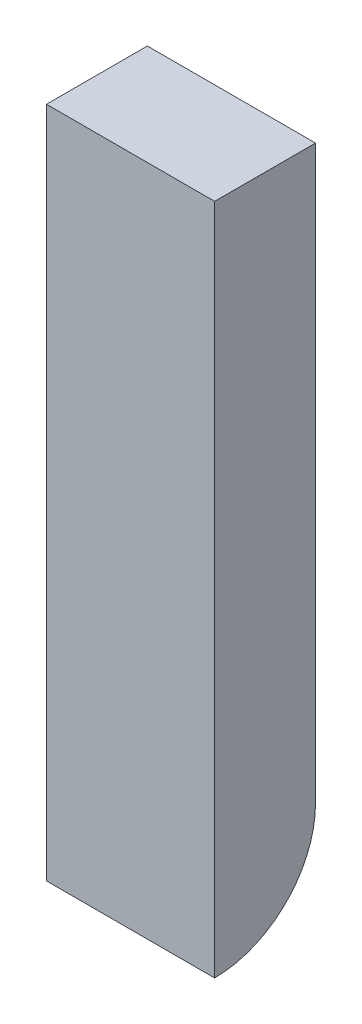
ISO-10303-21;
HEADER;
FILE_DESCRIPTION(('STEP AP214'),'2;1');
FILE_NAME('part.step','',(''),(''),'','','');
FILE_SCHEMA(('AUTOMOTIVE_DESIGN { 1 0 10303 214 1 1 1 1 }'));
ENDSEC;
DATA;
#1=APPLICATION_CONTEXT('core data for automotive mechanical design processes');
#2=APPLICATION_PROTOCOL_DEFINITION('international standard','automotive_design',2000,#1);
#3=PRODUCT_CONTEXT('',#1,'mechanical');
#4=PRODUCT('Part','Part','',(#3));
#5=PRODUCT_RELATED_PRODUCT_CATEGORY('part','',(#4));
#6=PRODUCT_DEFINITION_FORMATION('','',#4);
#7=PRODUCT_DEFINITION_CONTEXT('part definition',#1,'design');
#8=PRODUCT_DEFINITION('design','',#6,#7);
#9=PRODUCT_DEFINITION_SHAPE('','',#8);
#10=(LENGTH_UNIT() NAMED_UNIT(*) SI_UNIT(.MILLI.,.METRE.));
#11=(NAMED_UNIT(*) PLANE_ANGLE_UNIT() SI_UNIT($,.RADIAN.));
#12=(NAMED_UNIT(*) SI_UNIT($,.STERADIAN.) SOLID_ANGLE_UNIT());
#13=UNCERTAINTY_MEASURE_WITH_UNIT(LENGTH_MEASURE(1.E-05),#10,'distance_accuracy_value','');
#14=(GEOMETRIC_REPRESENTATION_CONTEXT(3) GLOBAL_UNCERTAINTY_ASSIGNED_CONTEXT((#13)) GLOBAL_UNIT_ASSIGNED_CONTEXT((#10,
#11,#12)) REPRESENTATION_CONTEXT('',''));
#15=CARTESIAN_POINT('',(0.,0.,0.));
#16=DIRECTION('',(0.,0.,1.));
#17=DIRECTION('',(1.,0.,0.));
#18=AXIS2_PLACEMENT_3D('',#15,#16,#17);
#19=CARTESIAN_POINT('',(-0.65,3.717714614865,0.06250323372777));
#20=DIRECTION('',(1.,0.,0.));
#21=DIRECTION('',(0.,-1.,0.));
#22=AXIS2_PLACEMENT_3D('',#19,#20,#21);
#23=PLANE('',#22);
#24=CARTESIAN_POINT('',(-0.65,3.425,0.12));
#25=DIRECTION('',(1.,0.,0.));
#26=DIRECTION('',(0.,1.,0.));
#27=AXIS2_PLACEMENT_3D('',#24,#25,#26);
#28=CIRCLE('',#27,0.12);
#29=CARTESIAN_POINT('',(-0.65,3.305,0.12));
#30=VERTEX_POINT('',#29);
#31=CARTESIAN_POINT('',(-0.65,3.425,0.));
#32=VERTEX_POINT('',#31);
#33=EDGE_CURVE('E11',#30,#32,#28,.T.);
#34=ORIENTED_EDGE('',*,*,#33,.T.);
#35=DIRECTION('',(0.,1.,0.));
#36=VECTOR('',#35,1.);
#37=CARTESIAN_POINT('',(-0.65,3.425,0.));
#38=LINE('',#37,#36);
#39=CARTESIAN_POINT('',(-0.65,4.105,0.));
#40=VERTEX_POINT('',#39);
#41=EDGE_CURVE('E105',#32,#40,#38,.T.);
#42=ORIENTED_EDGE('',*,*,#41,.T.);
#43=DIRECTION('',(0.,0.,-1.));
#44=VECTOR('',#43,1.);
#45=CARTESIAN_POINT('',(-0.65,4.105,0.12));
#46=LINE('',#45,#44);
#47=CARTESIAN_POINT('',(-0.65,4.105,0.12));
#48=VERTEX_POINT('',#47);
#49=EDGE_CURVE('E65',#48,#40,#46,.T.);
#50=ORIENTED_EDGE('',*,*,#49,.F.);
#51=DIRECTION('',(0.,1.,0.));
#52=VECTOR('',#51,1.);
#53=CARTESIAN_POINT('',(-0.65,3.305,0.12));
#54=LINE('',#53,#52);
#55=EDGE_CURVE('E94',#30,#48,#54,.T.);
#56=ORIENTED_EDGE('',*,*,#55,.F.);
#57=EDGE_LOOP('',(#34,#42,#50,#56));
#58=FACE_BOUND('',#57,.T.);
#59=ADVANCED_FACE('F17',(#58),#23,.T.);
#60=CARTESIAN_POINT('',(-0.85,3.717714614865,0.06250323372777));
#61=DIRECTION('',(1.,0.,0.));
#62=DIRECTION('',(0.,-1.,0.));
#63=AXIS2_PLACEMENT_3D('',#60,#61,#62);
#64=PLANE('',#63);
#65=DIRECTION('',(0.,1.,0.));
#66=VECTOR('',#65,1.);
#67=CARTESIAN_POINT('',(-0.85,3.305,0.12));
#68=LINE('',#67,#66);
#69=CARTESIAN_POINT('',(-0.85,3.305,0.12));
#70=VERTEX_POINT('',#69);
#71=CARTESIAN_POINT('',(-0.85,4.105,0.12));
#72=VERTEX_POINT('',#71);
#73=EDGE_CURVE('E87',#70,#72,#68,.T.);
#74=ORIENTED_EDGE('',*,*,#73,.T.);
#75=DIRECTION('',(0.,0.,-1.));
#76=VECTOR('',#75,1.);
#77=CARTESIAN_POINT('',(-0.85,4.105,0.12));
#78=LINE('',#77,#76);
#79=CARTESIAN_POINT('',(-0.85,4.105,0.));
#80=VERTEX_POINT('',#79);
#81=EDGE_CURVE('E73',#72,#80,#78,.T.);
#82=ORIENTED_EDGE('',*,*,#81,.T.);
#83=DIRECTION('',(0.,1.,0.));
#84=VECTOR('',#83,1.);
#85=CARTESIAN_POINT('',(-0.85,3.425,0.));
#86=LINE('',#85,#84);
#87=CARTESIAN_POINT('',(-0.85,3.425,0.));
#88=VERTEX_POINT('',#87);
#89=EDGE_CURVE('E84',#88,#80,#86,.T.);
#90=ORIENTED_EDGE('',*,*,#89,.F.);
#91=CARTESIAN_POINT('',(-0.85,3.425,0.12));
#92=DIRECTION('',(1.,0.,0.));
#93=DIRECTION('',(0.,1.,0.));
#94=AXIS2_PLACEMENT_3D('',#91,#92,#93);
#95=CIRCLE('',#94,0.12);
#96=EDGE_CURVE('E28',#70,#88,#95,.T.);
#97=ORIENTED_EDGE('',*,*,#96,.F.);
#98=EDGE_LOOP('',(#74,#82,#90,#97));
#99=FACE_BOUND('',#98,.T.);
#100=ADVANCED_FACE('F88',(#99),#64,.F.);
#101=CARTESIAN_POINT('',(-0.85,3.425,0.12));
#102=DIRECTION('',(-1.,0.,0.));
#103=DIRECTION('',(0.,1.,0.));
#104=AXIS2_PLACEMENT_3D('',#101,#102,#103);
#105=CYLINDRICAL_SURFACE('',#104,0.12);
#106=ORIENTED_EDGE('',*,*,#96,.T.);
#107=DIRECTION('',(1.,0.,0.));
#108=VECTOR('',#107,1.);
#109=CARTESIAN_POINT('',(-0.85,3.425,0.));
#110=LINE('',#109,#108);
#111=EDGE_CURVE('E108',#88,#32,#110,.T.);
#112=ORIENTED_EDGE('',*,*,#111,.T.);
#113=ORIENTED_EDGE('',*,*,#33,.F.);
#114=DIRECTION('',(1.,0.,0.));
#115=VECTOR('',#114,1.);
#116=CARTESIAN_POINT('',(-0.85,3.305,0.12));
#117=LINE('',#116,#115);
#118=EDGE_CURVE('E21',#70,#30,#117,.T.);
#119=ORIENTED_EDGE('',*,*,#118,.F.);
#120=EDGE_LOOP('',(#106,#112,#113,#119));
#121=FACE_BOUND('',#120,.T.);
#122=ADVANCED_FACE('F123',(#121),#105,.T.);
#123=CARTESIAN_POINT('',(-0.85,3.425,0.));
#124=DIRECTION('',(0.,0.,1.));
#125=DIRECTION('',(0.,-1.,0.));
#126=AXIS2_PLACEMENT_3D('',#123,#124,#125);
#127=PLANE('',#126);
#128=ORIENTED_EDGE('',*,*,#89,.T.);
#129=DIRECTION('',(1.,0.,0.));
#130=VECTOR('',#129,1.);
#131=CARTESIAN_POINT('',(-0.85,4.105,0.));
#132=LINE('',#131,#130);
#133=EDGE_CURVE('E80',#80,#40,#132,.T.);
#134=ORIENTED_EDGE('',*,*,#133,.T.);
#135=ORIENTED_EDGE('',*,*,#41,.F.);
#136=ORIENTED_EDGE('',*,*,#111,.F.);
#137=EDGE_LOOP('',(#128,#134,#135,#136));
#138=FACE_BOUND('',#137,.T.);
#139=ADVANCED_FACE('F19',(#138),#127,.F.);
#140=CARTESIAN_POINT('',(-0.85,4.105,0.12));
#141=DIRECTION('',(0.,1.,0.));
#142=DIRECTION('',(1.,0.,0.));
#143=AXIS2_PLACEMENT_3D('',#140,#141,#142);
#144=PLANE('',#143);
#145=DIRECTION('',(1.,0.,0.));
#146=VECTOR('',#145,1.);
#147=CARTESIAN_POINT('',(-0.85,4.105,0.12));
#148=LINE('',#147,#146);
#149=EDGE_CURVE('E77',#72,#48,#148,.T.);
#150=ORIENTED_EDGE('',*,*,#149,.T.);
#151=ORIENTED_EDGE('',*,*,#49,.T.);
#152=ORIENTED_EDGE('',*,*,#133,.F.);
#153=ORIENTED_EDGE('',*,*,#81,.F.);
#154=EDGE_LOOP('',(#150,#151,#152,#153));
#155=FACE_BOUND('',#154,.T.);
#156=ADVANCED_FACE('F75',(#155),#144,.T.);
#157=CARTESIAN_POINT('',(-0.85,3.305,0.12));
#158=DIRECTION('',(0.,0.,1.));
#159=DIRECTION('',(0.,-1.,0.));
#160=AXIS2_PLACEMENT_3D('',#157,#158,#159);
#161=PLANE('',#160);
#162=ORIENTED_EDGE('',*,*,#118,.T.);
#163=ORIENTED_EDGE('',*,*,#55,.T.);
#164=ORIENTED_EDGE('',*,*,#149,.F.);
#165=ORIENTED_EDGE('',*,*,#73,.F.);
#166=EDGE_LOOP('',(#162,#163,#164,#165));
#167=FACE_BOUND('',#166,.T.);
#168=ADVANCED_FACE('F93',(#167),#161,.T.);
#169=CLOSED_SHELL('',(#59,#100,#122,#139,#156,#168));
#170=MANIFOLD_SOLID_BREP('B1',#169);
#171=ADVANCED_BREP_SHAPE_REPRESENTATION('',(#18,#170),#14);
#172=SHAPE_DEFINITION_REPRESENTATION(#9,#171);
ENDSEC;
END-ISO-10303-21;
